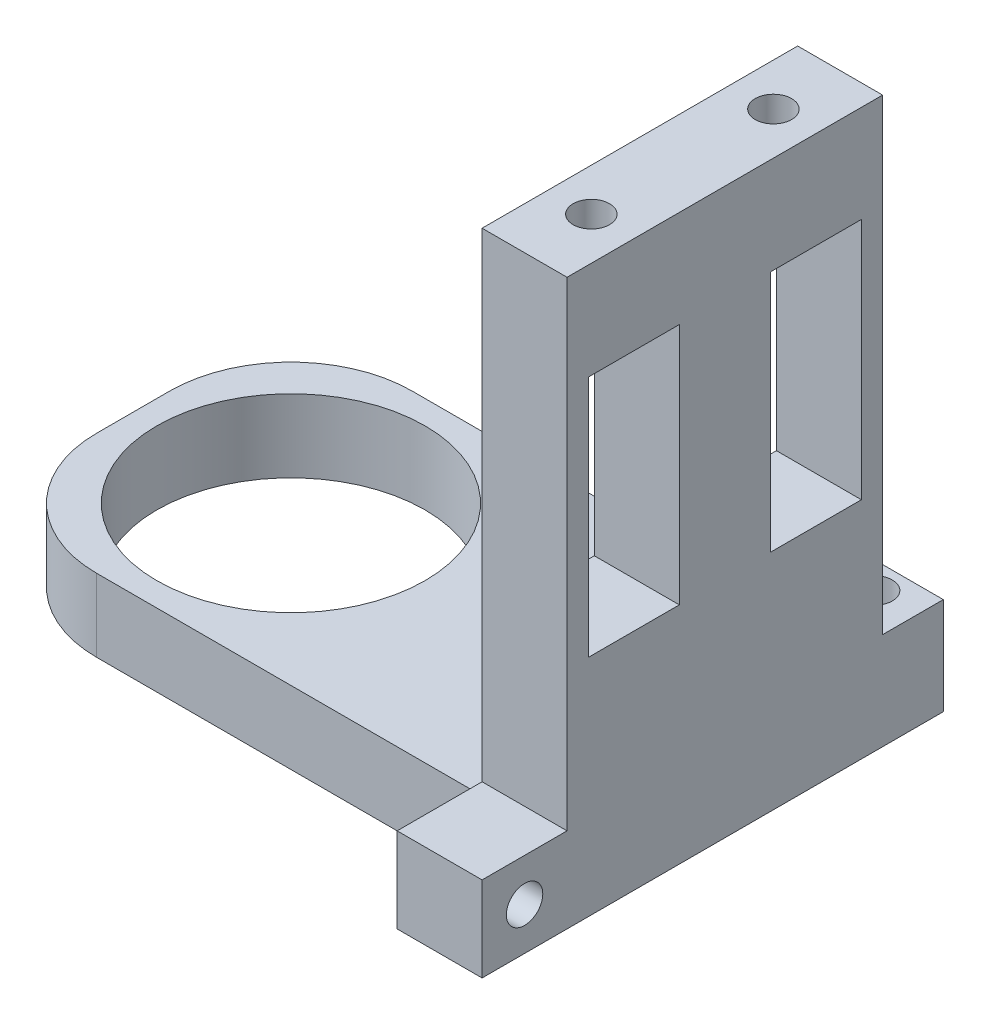
ISO-10303-21;
HEADER;
FILE_DESCRIPTION(('STEP AP214'),'2;1');
FILE_NAME('part.step','',(''),(''),'','','');
FILE_SCHEMA(('AUTOMOTIVE_DESIGN { 1 0 10303 214 1 1 1 1 }'));
ENDSEC;
DATA;
#1=APPLICATION_CONTEXT('core data for automotive mechanical design processes');
#2=APPLICATION_PROTOCOL_DEFINITION('international standard','automotive_design',2000,#1);
#3=PRODUCT_CONTEXT('',#1,'mechanical');
#4=PRODUCT('Part','Part','',(#3));
#5=PRODUCT_RELATED_PRODUCT_CATEGORY('part','',(#4));
#6=PRODUCT_DEFINITION_FORMATION('','',#4);
#7=PRODUCT_DEFINITION_CONTEXT('part definition',#1,'design');
#8=PRODUCT_DEFINITION('design','',#6,#7);
#9=PRODUCT_DEFINITION_SHAPE('','',#8);
#10=(LENGTH_UNIT() NAMED_UNIT(*) SI_UNIT(.MILLI.,.METRE.));
#11=(NAMED_UNIT(*) PLANE_ANGLE_UNIT() SI_UNIT($,.RADIAN.));
#12=(NAMED_UNIT(*) SI_UNIT($,.STERADIAN.) SOLID_ANGLE_UNIT());
#13=UNCERTAINTY_MEASURE_WITH_UNIT(LENGTH_MEASURE(1.E-05),#10,'distance_accuracy_value','');
#14=(GEOMETRIC_REPRESENTATION_CONTEXT(3) GLOBAL_UNCERTAINTY_ASSIGNED_CONTEXT((#13)) GLOBAL_UNIT_ASSIGNED_CONTEXT((#10,
#11,#12)) REPRESENTATION_CONTEXT('',''));
#15=CARTESIAN_POINT('',(0.,0.,0.));
#16=DIRECTION('',(0.,0.,1.));
#17=DIRECTION('',(1.,0.,0.));
#18=AXIS2_PLACEMENT_3D('',#15,#16,#17);
#19=CARTESIAN_POINT('',(17.375,0.,0.));
#20=DIRECTION('',(1.,0.,0.));
#21=DIRECTION('',(0.,0.,-1.));
#22=AXIS2_PLACEMENT_3D('',#19,#20,#21);
#23=PLANE('',#22);
#24=CARTESIAN_POINT('',(17.375,3.5,16.5));
#25=DIRECTION('',(1.,0.,0.));
#26=DIRECTION('',(0.,0.,-1.));
#27=AXIS2_PLACEMENT_3D('',#24,#25,#26);
#28=CIRCLE('',#27,1.49999999999998);
#29=CARTESIAN_POINT('',(17.375,3.5,15.));
#30=VERTEX_POINT('',#29);
#31=EDGE_CURVE('E414',#30,#30,#28,.T.);
#32=ORIENTED_EDGE('',*,*,#31,.T.);
#33=EDGE_LOOP('',(#32));
#34=FACE_BOUND('',#33,.T.);
#35=DIRECTION('',(0.,0.,-1.));
#36=VECTOR('',#35,1.);
#37=CARTESIAN_POINT('',(17.375,18.5,11.25));
#38=LINE('',#37,#36);
#39=CARTESIAN_POINT('',(17.375,18.5,11.25));
#40=VERTEX_POINT('',#39);
#41=CARTESIAN_POINT('',(17.375,18.5,3.75));
#42=VERTEX_POINT('',#41);
#43=EDGE_CURVE('E256',#40,#42,#38,.T.);
#44=ORIENTED_EDGE('',*,*,#43,.T.);
#45=DIRECTION('',(0.,1.,0.));
#46=VECTOR('',#45,1.);
#47=CARTESIAN_POINT('',(17.375,18.5,3.75));
#48=LINE('',#47,#46);
#49=CARTESIAN_POINT('',(17.375,38.5,3.75));
#50=VERTEX_POINT('',#49);
#51=EDGE_CURVE('E246',#42,#50,#48,.T.);
#52=ORIENTED_EDGE('',*,*,#51,.T.);
#53=DIRECTION('',(0.,0.,1.));
#54=VECTOR('',#53,1.);
#55=CARTESIAN_POINT('',(17.375,38.5,3.75));
#56=LINE('',#55,#54);
#57=CARTESIAN_POINT('',(17.375,38.5,11.25));
#58=VERTEX_POINT('',#57);
#59=EDGE_CURVE('E249',#50,#58,#56,.T.);
#60=ORIENTED_EDGE('',*,*,#59,.T.);
#61=DIRECTION('',(0.,-1.,0.));
#62=VECTOR('',#61,1.);
#63=CARTESIAN_POINT('',(17.375,38.5,11.25));
#64=LINE('',#63,#62);
#65=EDGE_CURVE('E253',#58,#40,#64,.T.);
#66=ORIENTED_EDGE('',*,*,#65,.T.);
#67=EDGE_LOOP('',(#44,#52,#60,#66));
#68=FACE_BOUND('',#67,.T.);
#69=DIRECTION('',(0.,0.,1.));
#70=VECTOR('',#69,1.);
#71=CARTESIAN_POINT('',(17.375,18.5,-11.25));
#72=LINE('',#71,#70);
#73=CARTESIAN_POINT('',(17.375,18.5,-11.25));
#74=VERTEX_POINT('',#73);
#75=CARTESIAN_POINT('',(17.375,18.5,-3.75));
#76=VERTEX_POINT('',#75);
#77=EDGE_CURVE('E229',#74,#76,#72,.T.);
#78=ORIENTED_EDGE('',*,*,#77,.F.);
#79=DIRECTION('',(0.,-1.,0.));
#80=VECTOR('',#79,1.);
#81=CARTESIAN_POINT('',(17.375,38.5,-11.25));
#82=LINE('',#81,#80);
#83=CARTESIAN_POINT('',(17.375,38.5,-11.25));
#84=VERTEX_POINT('',#83);
#85=EDGE_CURVE('E213',#84,#74,#82,.T.);
#86=ORIENTED_EDGE('',*,*,#85,.F.);
#87=DIRECTION('',(0.,0.,-1.));
#88=VECTOR('',#87,1.);
#89=CARTESIAN_POINT('',(17.375,38.5,-3.75));
#90=LINE('',#89,#88);
#91=CARTESIAN_POINT('',(17.375,38.5,-3.75));
#92=VERTEX_POINT('',#91);
#93=EDGE_CURVE('E218',#92,#84,#90,.T.);
#94=ORIENTED_EDGE('',*,*,#93,.F.);
#95=DIRECTION('',(0.,1.,0.));
#96=VECTOR('',#95,1.);
#97=CARTESIAN_POINT('',(17.375,18.5,-3.75));
#98=LINE('',#97,#96);
#99=EDGE_CURVE('E232',#76,#92,#98,.T.);
#100=ORIENTED_EDGE('',*,*,#99,.F.);
#101=EDGE_LOOP('',(#78,#86,#94,#100));
#102=FACE_BOUND('',#101,.T.);
#103=DIRECTION('',(0.,-1.,0.));
#104=VECTOR('',#103,1.);
#105=CARTESIAN_POINT('',(17.375,0.,-13.));
#106=LINE('',#105,#104);
#107=CARTESIAN_POINT('',(17.375,6.,-13.));
#108=VERTEX_POINT('',#107);
#109=CARTESIAN_POINT('',(17.375,0.,-13.));
#110=VERTEX_POINT('',#109);
#111=EDGE_CURVE('E199',#108,#110,#106,.T.);
#112=ORIENTED_EDGE('',*,*,#111,.F.);
#113=DIRECTION('',(0.,0.,-1.));
#114=VECTOR('',#113,1.);
#115=CARTESIAN_POINT('',(17.375,6.,-13.));
#116=LINE('',#115,#114);
#117=CARTESIAN_POINT('',(17.375,6.,13.));
#118=VERTEX_POINT('',#117);
#119=EDGE_CURVE('E185',#118,#108,#116,.T.);
#120=ORIENTED_EDGE('',*,*,#119,.F.);
#121=DIRECTION('',(0.,1.,0.));
#122=VECTOR('',#121,1.);
#123=CARTESIAN_POINT('',(17.375,6.,13.));
#124=LINE('',#123,#122);
#125=CARTESIAN_POINT('',(17.375,0.,13.));
#126=VERTEX_POINT('',#125);
#127=EDGE_CURVE('E195',#126,#118,#124,.T.);
#128=ORIENTED_EDGE('',*,*,#127,.F.);
#129=DIRECTION('',(0.,0.,-1.));
#130=VECTOR('',#129,1.);
#131=CARTESIAN_POINT('',(17.375,0.,20.));
#132=LINE('',#131,#130);
#133=CARTESIAN_POINT('',(17.375,0.,20.));
#134=VERTEX_POINT('',#133);
#135=EDGE_CURVE('E318',#134,#126,#132,.T.);
#136=ORIENTED_EDGE('',*,*,#135,.F.);
#137=DIRECTION('',(0.,-1.,0.));
#138=VECTOR('',#137,1.);
#139=CARTESIAN_POINT('',(17.375,46.5,20.));
#140=LINE('',#139,#138);
#141=CARTESIAN_POINT('',(17.375,7.,20.));
#142=VERTEX_POINT('',#141);
#143=EDGE_CURVE('E314',#142,#134,#140,.T.);
#144=ORIENTED_EDGE('',*,*,#143,.F.);
#145=DIRECTION('',(0.,0.,1.));
#146=VECTOR('',#145,1.);
#147=CARTESIAN_POINT('',(17.375,7.,13.));
#148=LINE('',#147,#146);
#149=CARTESIAN_POINT('',(17.375,7.,13.));
#150=VERTEX_POINT('',#149);
#151=EDGE_CURVE('E282',#150,#142,#148,.T.);
#152=ORIENTED_EDGE('',*,*,#151,.F.);
#153=DIRECTION('',(0.,-1.,0.));
#154=VECTOR('',#153,1.);
#155=CARTESIAN_POINT('',(17.375,46.5,13.));
#156=LINE('',#155,#154);
#157=CARTESIAN_POINT('',(17.375,46.5,13.));
#158=VERTEX_POINT('',#157);
#159=EDGE_CURVE('E271',#158,#150,#156,.T.);
#160=ORIENTED_EDGE('',*,*,#159,.F.);
#161=DIRECTION('',(0.,0.,1.));
#162=VECTOR('',#161,1.);
#163=CARTESIAN_POINT('',(17.375,46.5,-18.));
#164=LINE('',#163,#162);
#165=CARTESIAN_POINT('',(17.375,46.5,-13.));
#166=VERTEX_POINT('',#165);
#167=EDGE_CURVE('E323',#166,#158,#164,.T.);
#168=ORIENTED_EDGE('',*,*,#167,.F.);
#169=DIRECTION('',(0.,1.,0.));
#170=VECTOR('',#169,1.);
#171=CARTESIAN_POINT('',(17.375,8.,-13.));
#172=LINE('',#171,#170);
#173=CARTESIAN_POINT('',(17.375,8.,-13.));
#174=VERTEX_POINT('',#173);
#175=EDGE_CURVE('E300',#174,#166,#172,.T.);
#176=ORIENTED_EDGE('',*,*,#175,.F.);
#177=DIRECTION('',(0.,0.,1.));
#178=VECTOR('',#177,1.);
#179=CARTESIAN_POINT('',(17.375,8.,-18.));
#180=LINE('',#179,#178);
#181=CARTESIAN_POINT('',(17.375,8.,-18.));
#182=VERTEX_POINT('',#181);
#183=EDGE_CURVE('E292',#182,#174,#180,.T.);
#184=ORIENTED_EDGE('',*,*,#183,.F.);
#185=DIRECTION('',(0.,1.,0.));
#186=VECTOR('',#185,1.);
#187=CARTESIAN_POINT('',(17.375,0.,-18.));
#188=LINE('',#187,#186);
#189=CARTESIAN_POINT('',(17.375,0.,-18.));
#190=VERTEX_POINT('',#189);
#191=EDGE_CURVE('E320',#190,#182,#188,.T.);
#192=ORIENTED_EDGE('',*,*,#191,.F.);
#193=EDGE_CURVE('E316',#110,#190,#132,.T.);
#194=ORIENTED_EDGE('',*,*,#193,.F.);
#195=EDGE_LOOP('',(#112,#120,#128,#136,#144,#152,#160,#168,#176,#184,#192,#194));
#196=FACE_BOUND('',#195,.T.);
#197=ADVANCED_FACE('F32',(#34,#68,#102,#196),#23,.F.);
#198=CARTESIAN_POINT('',(17.375,46.5,20.));
#199=DIRECTION('',(0.,0.,1.));
#200=DIRECTION('',(1.,0.,0.));
#201=AXIS2_PLACEMENT_3D('',#198,#199,#200);
#202=PLANE('',#201);
#203=DIRECTION('',(-1.,0.,0.));
#204=VECTOR('',#203,1.);
#205=CARTESIAN_POINT('',(24.375,7.,20.));
#206=LINE('',#205,#204);
#207=CARTESIAN_POINT('',(24.375,7.,20.));
#208=VERTEX_POINT('',#207);
#209=EDGE_CURVE('E289',#208,#142,#206,.T.);
#210=ORIENTED_EDGE('',*,*,#209,.T.);
#211=ORIENTED_EDGE('',*,*,#143,.T.);
#212=DIRECTION('',(1.,0.,0.));
#213=VECTOR('',#212,1.);
#214=CARTESIAN_POINT('',(17.375,0.,20.));
#215=LINE('',#214,#213);
#216=CARTESIAN_POINT('',(24.375,0.,20.));
#217=VERTEX_POINT('',#216);
#218=EDGE_CURVE('E326',#134,#217,#215,.T.);
#219=ORIENTED_EDGE('',*,*,#218,.T.);
#220=DIRECTION('',(0.,-1.,0.));
#221=VECTOR('',#220,1.);
#222=CARTESIAN_POINT('',(24.375,46.5,20.));
#223=LINE('',#222,#221);
#224=EDGE_CURVE('E309',#208,#217,#223,.T.);
#225=ORIENTED_EDGE('',*,*,#224,.F.);
#226=EDGE_LOOP('',(#210,#211,#219,#225));
#227=FACE_BOUND('',#226,.T.);
#228=ADVANCED_FACE('F373',(#227),#202,.T.);
#229=CARTESIAN_POINT('',(17.375,46.5,-18.));
#230=DIRECTION('',(0.,1.,0.));
#231=DIRECTION('',(0.,0.,1.));
#232=AXIS2_PLACEMENT_3D('',#229,#230,#231);
#233=PLANE('',#232);
#234=CARTESIAN_POINT('',(20.875,46.5,7.5));
#235=DIRECTION('',(0.,1.,0.));
#236=DIRECTION('',(0.,0.,1.));
#237=AXIS2_PLACEMENT_3D('',#234,#235,#236);
#238=CIRCLE('',#237,1.49999999999999);
#239=CARTESIAN_POINT('',(20.875,46.5,8.99999999999999));
#240=VERTEX_POINT('',#239);
#241=EDGE_CURVE('E422',#240,#240,#238,.T.);
#242=ORIENTED_EDGE('',*,*,#241,.F.);
#243=EDGE_LOOP('',(#242));
#244=FACE_BOUND('',#243,.T.);
#245=CARTESIAN_POINT('',(20.875,46.5,-7.5));
#246=DIRECTION('',(0.,1.,0.));
#247=DIRECTION('',(0.,0.,1.));
#248=AXIS2_PLACEMENT_3D('',#245,#246,#247);
#249=CIRCLE('',#248,1.49999999999999);
#250=CARTESIAN_POINT('',(20.875,46.5,-6.00000000000001));
#251=VERTEX_POINT('',#250);
#252=EDGE_CURVE('E428',#251,#251,#249,.T.);
#253=ORIENTED_EDGE('',*,*,#252,.F.);
#254=EDGE_LOOP('',(#253));
#255=FACE_BOUND('',#254,.T.);
#256=DIRECTION('',(-1.,0.,0.));
#257=VECTOR('',#256,1.);
#258=CARTESIAN_POINT('',(24.375,46.5,13.));
#259=LINE('',#258,#257);
#260=CARTESIAN_POINT('',(24.375,46.5,13.));
#261=VERTEX_POINT('',#260);
#262=EDGE_CURVE('E285',#261,#158,#259,.T.);
#263=ORIENTED_EDGE('',*,*,#262,.F.);
#264=DIRECTION('',(0.,0.,1.));
#265=VECTOR('',#264,1.);
#266=CARTESIAN_POINT('',(24.375,46.5,-18.));
#267=LINE('',#266,#265);
#268=CARTESIAN_POINT('',(24.375,46.5,-13.));
#269=VERTEX_POINT('',#268);
#270=EDGE_CURVE('E317',#269,#261,#267,.T.);
#271=ORIENTED_EDGE('',*,*,#270,.F.);
#272=DIRECTION('',(-1.,0.,0.));
#273=VECTOR('',#272,1.);
#274=CARTESIAN_POINT('',(24.375,46.5,-13.));
#275=LINE('',#274,#273);
#276=EDGE_CURVE('E310',#269,#166,#275,.T.);
#277=ORIENTED_EDGE('',*,*,#276,.T.);
#278=ORIENTED_EDGE('',*,*,#167,.T.);
#279=EDGE_LOOP('',(#263,#271,#277,#278));
#280=FACE_BOUND('',#279,.T.);
#281=ADVANCED_FACE('F379',(#244,#255,#280),#233,.T.);
#282=CARTESIAN_POINT('',(17.375,0.,-18.));
#283=DIRECTION('',(0.,0.,-1.));
#284=DIRECTION('',(-1.,0.,0.));
#285=AXIS2_PLACEMENT_3D('',#282,#283,#284);
#286=PLANE('',#285);
#287=DIRECTION('',(-1.,0.,0.));
#288=VECTOR('',#287,1.);
#289=CARTESIAN_POINT('',(24.375,8.,-18.));
#290=LINE('',#289,#288);
#291=CARTESIAN_POINT('',(24.375,8.,-18.));
#292=VERTEX_POINT('',#291);
#293=EDGE_CURVE('E307',#292,#182,#290,.T.);
#294=ORIENTED_EDGE('',*,*,#293,.F.);
#295=DIRECTION('',(0.,1.,0.));
#296=VECTOR('',#295,1.);
#297=CARTESIAN_POINT('',(24.375,0.,-18.));
#298=LINE('',#297,#296);
#299=CARTESIAN_POINT('',(24.375,0.,-18.));
#300=VERTEX_POINT('',#299);
#301=EDGE_CURVE('E331',#300,#292,#298,.T.);
#302=ORIENTED_EDGE('',*,*,#301,.F.);
#303=DIRECTION('',(1.,0.,0.));
#304=VECTOR('',#303,1.);
#305=CARTESIAN_POINT('',(17.375,0.,-18.));
#306=LINE('',#305,#304);
#307=EDGE_CURVE('E336',#190,#300,#306,.T.);
#308=ORIENTED_EDGE('',*,*,#307,.F.);
#309=ORIENTED_EDGE('',*,*,#191,.T.);
#310=EDGE_LOOP('',(#294,#302,#308,#309));
#311=FACE_BOUND('',#310,.T.);
#312=ADVANCED_FACE('F393',(#311),#286,.T.);
#313=CARTESIAN_POINT('',(17.375,0.,20.));
#314=DIRECTION('',(0.,-1.,0.));
#315=DIRECTION('',(0.,0.,-1.));
#316=AXIS2_PLACEMENT_3D('',#313,#314,#315);
#317=PLANE('',#316);
#318=CARTESIAN_POINT('',(-11.375,0.,0.));
#319=DIRECTION('',(0.,-1.,0.));
#320=DIRECTION('',(0.,0.,-1.));
#321=AXIS2_PLACEMENT_3D('',#318,#319,#320);
#322=CIRCLE('',#321,11.05);
#323=CARTESIAN_POINT('',(-11.375,0.,-11.05));
#324=VERTEX_POINT('',#323);
#325=EDGE_CURVE('E405',#324,#324,#322,.T.);
#326=ORIENTED_EDGE('',*,*,#325,.F.);
#327=EDGE_LOOP('',(#326));
#328=FACE_BOUND('',#327,.T.);
#329=CARTESIAN_POINT('',(20.875,0.,-15.8));
#330=DIRECTION('',(0.,1.,0.));
#331=DIRECTION('',(0.,0.,1.));
#332=AXIS2_PLACEMENT_3D('',#329,#330,#331);
#333=CIRCLE('',#332,1.49999999999999);
#334=CARTESIAN_POINT('',(20.875,0.,-14.3));
#335=VERTEX_POINT('',#334);
#336=EDGE_CURVE('E408',#335,#335,#333,.T.);
#337=ORIENTED_EDGE('',*,*,#336,.T.);
#338=EDGE_LOOP('',(#337));
#339=FACE_BOUND('',#338,.T.);
#340=DIRECTION('',(1.,0.,0.));
#341=VECTOR('',#340,1.);
#342=CARTESIAN_POINT('',(-24.375,0.,13.));
#343=LINE('',#342,#341);
#344=CARTESIAN_POINT('',(-14.375,0.,13.));
#345=VERTEX_POINT('',#344);
#346=EDGE_CURVE('E188',#345,#126,#343,.T.);
#347=ORIENTED_EDGE('',*,*,#346,.F.);
#348=CARTESIAN_POINT('',(-14.375,0.,3.));
#349=DIRECTION('',(0.,-1.,0.));
#350=DIRECTION('',(0.,0.,-1.));
#351=AXIS2_PLACEMENT_3D('',#348,#349,#350);
#352=CIRCLE('',#351,10.);
#353=CARTESIAN_POINT('',(-24.375,0.,3.));
#354=VERTEX_POINT('',#353);
#355=EDGE_CURVE('E40',#345,#354,#352,.T.);
#356=ORIENTED_EDGE('',*,*,#355,.T.);
#357=DIRECTION('',(0.,0.,1.));
#358=VECTOR('',#357,1.);
#359=CARTESIAN_POINT('',(-24.375,0.,13.));
#360=LINE('',#359,#358);
#361=CARTESIAN_POINT('',(-24.375,0.,-2.99999999999999));
#362=VERTEX_POINT('',#361);
#363=EDGE_CURVE('E200',#362,#354,#360,.T.);
#364=ORIENTED_EDGE('',*,*,#363,.F.);
#365=CARTESIAN_POINT('',(-14.375,0.,-3.));
#366=DIRECTION('',(0.,-1.,0.));
#367=DIRECTION('',(0.,0.,-1.));
#368=AXIS2_PLACEMENT_3D('',#365,#366,#367);
#369=CIRCLE('',#368,10.);
#370=CARTESIAN_POINT('',(-14.375,0.,-13.));
#371=VERTEX_POINT('',#370);
#372=EDGE_CURVE('E47',#362,#371,#369,.T.);
#373=ORIENTED_EDGE('',*,*,#372,.T.);
#374=DIRECTION('',(1.,0.,0.));
#375=VECTOR('',#374,1.);
#376=CARTESIAN_POINT('',(-24.375,0.,-13.));
#377=LINE('',#376,#375);
#378=EDGE_CURVE('E211',#371,#110,#377,.T.);
#379=ORIENTED_EDGE('',*,*,#378,.T.);
#380=ORIENTED_EDGE('',*,*,#193,.T.);
#381=ORIENTED_EDGE('',*,*,#307,.T.);
#382=DIRECTION('',(0.,0.,-1.));
#383=VECTOR('',#382,1.);
#384=CARTESIAN_POINT('',(24.375,0.,20.));
#385=LINE('',#384,#383);
#386=EDGE_CURVE('E328',#217,#300,#385,.T.);
#387=ORIENTED_EDGE('',*,*,#386,.F.);
#388=ORIENTED_EDGE('',*,*,#218,.F.);
#389=ORIENTED_EDGE('',*,*,#135,.T.);
#390=EDGE_LOOP('',(#347,#356,#364,#373,#379,#380,#381,#387,#388,#389));
#391=FACE_BOUND('',#390,.T.);
#392=ADVANCED_FACE('F352',(#328,#339,#391),#317,.T.);
#393=CARTESIAN_POINT('',(24.375,0.,0.));
#394=DIRECTION('',(1.,0.,0.));
#395=DIRECTION('',(0.,0.,-1.));
#396=AXIS2_PLACEMENT_3D('',#393,#394,#395);
#397=PLANE('',#396);
#398=CARTESIAN_POINT('',(24.375,3.5,16.5));
#399=DIRECTION('',(1.,0.,0.));
#400=DIRECTION('',(0.,0.,-1.));
#401=AXIS2_PLACEMENT_3D('',#398,#399,#400);
#402=CIRCLE('',#401,1.49999999999999);
#403=CARTESIAN_POINT('',(24.375,3.5,15.));
#404=VERTEX_POINT('',#403);
#405=EDGE_CURVE('E410',#404,#404,#402,.T.);
#406=ORIENTED_EDGE('',*,*,#405,.F.);
#407=EDGE_LOOP('',(#406));
#408=FACE_BOUND('',#407,.T.);
#409=DIRECTION('',(0.,-1.,0.));
#410=VECTOR('',#409,1.);
#411=CARTESIAN_POINT('',(24.375,38.5,-11.25));
#412=LINE('',#411,#410);
#413=CARTESIAN_POINT('',(24.375,38.5,-11.25));
#414=VERTEX_POINT('',#413);
#415=CARTESIAN_POINT('',(24.375,18.5,-11.25));
#416=VERTEX_POINT('',#415);
#417=EDGE_CURVE('E214',#414,#416,#412,.T.);
#418=ORIENTED_EDGE('',*,*,#417,.T.);
#419=DIRECTION('',(0.,0.,1.));
#420=VECTOR('',#419,1.);
#421=CARTESIAN_POINT('',(24.375,18.5,-11.25));
#422=LINE('',#421,#420);
#423=CARTESIAN_POINT('',(24.375,18.5,-3.75));
#424=VERTEX_POINT('',#423);
#425=EDGE_CURVE('E217',#416,#424,#422,.T.);
#426=ORIENTED_EDGE('',*,*,#425,.T.);
#427=DIRECTION('',(0.,1.,0.));
#428=VECTOR('',#427,1.);
#429=CARTESIAN_POINT('',(24.375,18.5,-3.75));
#430=LINE('',#429,#428);
#431=CARTESIAN_POINT('',(24.375,38.5,-3.75));
#432=VERTEX_POINT('',#431);
#433=EDGE_CURVE('E221',#424,#432,#430,.T.);
#434=ORIENTED_EDGE('',*,*,#433,.T.);
#435=DIRECTION('',(0.,0.,-1.));
#436=VECTOR('',#435,1.);
#437=CARTESIAN_POINT('',(24.375,38.5,-3.75));
#438=LINE('',#437,#436);
#439=EDGE_CURVE('E224',#432,#414,#438,.T.);
#440=ORIENTED_EDGE('',*,*,#439,.T.);
#441=EDGE_LOOP('',(#418,#426,#434,#440));
#442=FACE_BOUND('',#441,.T.);
#443=DIRECTION('',(0.,1.,0.));
#444=VECTOR('',#443,1.);
#445=CARTESIAN_POINT('',(24.375,18.5,3.75));
#446=LINE('',#445,#444);
#447=CARTESIAN_POINT('',(24.375,18.5,3.75));
#448=VERTEX_POINT('',#447);
#449=CARTESIAN_POINT('',(24.375,38.5,3.75));
#450=VERTEX_POINT('',#449);
#451=EDGE_CURVE('E239',#448,#450,#446,.T.);
#452=ORIENTED_EDGE('',*,*,#451,.F.);
#453=DIRECTION('',(0.,0.,-1.));
#454=VECTOR('',#453,1.);
#455=CARTESIAN_POINT('',(24.375,18.5,11.25));
#456=LINE('',#455,#454);
#457=CARTESIAN_POINT('',(24.375,18.5,11.25));
#458=VERTEX_POINT('',#457);
#459=EDGE_CURVE('E250',#458,#448,#456,.T.);
#460=ORIENTED_EDGE('',*,*,#459,.F.);
#461=DIRECTION('',(0.,-1.,0.));
#462=VECTOR('',#461,1.);
#463=CARTESIAN_POINT('',(24.375,38.5,11.25));
#464=LINE('',#463,#462);
#465=CARTESIAN_POINT('',(24.375,38.5,11.25));
#466=VERTEX_POINT('',#465);
#467=EDGE_CURVE('E264',#466,#458,#464,.T.);
#468=ORIENTED_EDGE('',*,*,#467,.F.);
#469=DIRECTION('',(0.,0.,1.));
#470=VECTOR('',#469,1.);
#471=CARTESIAN_POINT('',(24.375,38.5,3.75));
#472=LINE('',#471,#470);
#473=EDGE_CURVE('E261',#450,#466,#472,.T.);
#474=ORIENTED_EDGE('',*,*,#473,.F.);
#475=EDGE_LOOP('',(#452,#460,#468,#474));
#476=FACE_BOUND('',#475,.T.);
#477=DIRECTION('',(0.,0.,1.));
#478=VECTOR('',#477,1.);
#479=CARTESIAN_POINT('',(24.375,7.,13.));
#480=LINE('',#479,#478);
#481=CARTESIAN_POINT('',(24.375,7.,13.));
#482=VERTEX_POINT('',#481);
#483=EDGE_CURVE('E281',#482,#208,#480,.T.);
#484=ORIENTED_EDGE('',*,*,#483,.T.);
#485=ORIENTED_EDGE('',*,*,#224,.T.);
#486=ORIENTED_EDGE('',*,*,#386,.T.);
#487=ORIENTED_EDGE('',*,*,#301,.T.);
#488=DIRECTION('',(0.,0.,1.));
#489=VECTOR('',#488,1.);
#490=CARTESIAN_POINT('',(24.375,8.,-18.));
#491=LINE('',#490,#489);
#492=CARTESIAN_POINT('',(24.375,8.,-13.));
#493=VERTEX_POINT('',#492);
#494=EDGE_CURVE('E296',#292,#493,#491,.T.);
#495=ORIENTED_EDGE('',*,*,#494,.T.);
#496=DIRECTION('',(0.,1.,0.));
#497=VECTOR('',#496,1.);
#498=CARTESIAN_POINT('',(24.375,8.,-13.));
#499=LINE('',#498,#497);
#500=EDGE_CURVE('E299',#493,#269,#499,.T.);
#501=ORIENTED_EDGE('',*,*,#500,.T.);
#502=ORIENTED_EDGE('',*,*,#270,.T.);
#503=DIRECTION('',(0.,-1.,0.));
#504=VECTOR('',#503,1.);
#505=CARTESIAN_POINT('',(24.375,46.5,13.));
#506=LINE('',#505,#504);
#507=EDGE_CURVE('E278',#261,#482,#506,.T.);
#508=ORIENTED_EDGE('',*,*,#507,.T.);
#509=EDGE_LOOP('',(#484,#485,#486,#487,#495,#501,#502,#508));
#510=FACE_BOUND('',#509,.T.);
#511=ADVANCED_FACE('F387',(#408,#442,#476,#510),#397,.T.);
#512=CARTESIAN_POINT('',(24.375,8.,-18.));
#513=DIRECTION('',(0.,-1.,0.));
#514=DIRECTION('',(0.,0.,-1.));
#515=AXIS2_PLACEMENT_3D('',#512,#513,#514);
#516=PLANE('',#515);
#517=CARTESIAN_POINT('',(20.875,8.,-15.8));
#518=DIRECTION('',(0.,1.,0.));
#519=DIRECTION('',(0.,0.,1.));
#520=AXIS2_PLACEMENT_3D('',#517,#518,#519);
#521=CIRCLE('',#520,1.49999999999999);
#522=CARTESIAN_POINT('',(20.875,8.,-14.3));
#523=VERTEX_POINT('',#522);
#524=EDGE_CURVE('E411',#523,#523,#521,.T.);
#525=ORIENTED_EDGE('',*,*,#524,.F.);
#526=EDGE_LOOP('',(#525));
#527=FACE_BOUND('',#526,.T.);
#528=ORIENTED_EDGE('',*,*,#183,.T.);
#529=DIRECTION('',(-1.,0.,0.));
#530=VECTOR('',#529,1.);
#531=CARTESIAN_POINT('',(24.375,8.,-13.));
#532=LINE('',#531,#530);
#533=EDGE_CURVE('E303',#493,#174,#532,.T.);
#534=ORIENTED_EDGE('',*,*,#533,.F.);
#535=ORIENTED_EDGE('',*,*,#494,.F.);
#536=ORIENTED_EDGE('',*,*,#293,.T.);
#537=EDGE_LOOP('',(#528,#534,#535,#536));
#538=FACE_BOUND('',#537,.T.);
#539=ADVANCED_FACE('F385',(#527,#538),#516,.F.);
#540=CARTESIAN_POINT('',(24.375,8.,-13.));
#541=DIRECTION('',(0.,0.,1.));
#542=DIRECTION('',(1.,0.,0.));
#543=AXIS2_PLACEMENT_3D('',#540,#541,#542);
#544=PLANE('',#543);
#545=ORIENTED_EDGE('',*,*,#175,.T.);
#546=ORIENTED_EDGE('',*,*,#276,.F.);
#547=ORIENTED_EDGE('',*,*,#500,.F.);
#548=ORIENTED_EDGE('',*,*,#533,.T.);
#549=EDGE_LOOP('',(#545,#546,#547,#548));
#550=FACE_BOUND('',#549,.T.);
#551=ADVANCED_FACE('F460',(#550),#544,.F.);
#552=CARTESIAN_POINT('',(24.375,7.,13.));
#553=DIRECTION('',(0.,-1.,0.));
#554=DIRECTION('',(0.,0.,-1.));
#555=AXIS2_PLACEMENT_3D('',#552,#553,#554);
#556=PLANE('',#555);
#557=ORIENTED_EDGE('',*,*,#151,.T.);
#558=ORIENTED_EDGE('',*,*,#209,.F.);
#559=ORIENTED_EDGE('',*,*,#483,.F.);
#560=DIRECTION('',(-1.,0.,0.));
#561=VECTOR('',#560,1.);
#562=CARTESIAN_POINT('',(24.375,7.,13.));
#563=LINE('',#562,#561);
#564=EDGE_CURVE('E293',#482,#150,#563,.T.);
#565=ORIENTED_EDGE('',*,*,#564,.T.);
#566=EDGE_LOOP('',(#557,#558,#559,#565));
#567=FACE_BOUND('',#566,.T.);
#568=ADVANCED_FACE('F451',(#567),#556,.F.);
#569=CARTESIAN_POINT('',(24.375,46.5,13.));
#570=DIRECTION('',(0.,0.,-1.));
#571=DIRECTION('',(-1.,0.,0.));
#572=AXIS2_PLACEMENT_3D('',#569,#570,#571);
#573=PLANE('',#572);
#574=ORIENTED_EDGE('',*,*,#159,.T.);
#575=ORIENTED_EDGE('',*,*,#564,.F.);
#576=ORIENTED_EDGE('',*,*,#507,.F.);
#577=ORIENTED_EDGE('',*,*,#262,.T.);
#578=EDGE_LOOP('',(#574,#575,#576,#577));
#579=FACE_BOUND('',#578,.T.);
#580=ADVANCED_FACE('F454',(#579),#573,.F.);
#581=CARTESIAN_POINT('',(17.375,18.5,3.75));
#582=DIRECTION('',(0.,0.,-1.));
#583=DIRECTION('',(-1.,0.,0.));
#584=AXIS2_PLACEMENT_3D('',#581,#582,#583);
#585=PLANE('',#584);
#586=ORIENTED_EDGE('',*,*,#451,.T.);
#587=DIRECTION('',(1.,0.,0.));
#588=VECTOR('',#587,1.);
#589=CARTESIAN_POINT('',(17.375,38.5,3.75));
#590=LINE('',#589,#588);
#591=EDGE_CURVE('E259',#50,#450,#590,.T.);
#592=ORIENTED_EDGE('',*,*,#591,.F.);
#593=ORIENTED_EDGE('',*,*,#51,.F.);
#594=DIRECTION('',(1.,0.,0.));
#595=VECTOR('',#594,1.);
#596=CARTESIAN_POINT('',(17.375,18.5,3.75));
#597=LINE('',#596,#595);
#598=EDGE_CURVE('E269',#42,#448,#597,.T.);
#599=ORIENTED_EDGE('',*,*,#598,.T.);
#600=EDGE_LOOP('',(#586,#592,#593,#599));
#601=FACE_BOUND('',#600,.T.);
#602=ADVANCED_FACE('F516',(#601),#585,.F.);
#603=CARTESIAN_POINT('',(17.375,18.5,11.25));
#604=DIRECTION('',(0.,-1.,0.));
#605=DIRECTION('',(0.,0.,-1.));
#606=AXIS2_PLACEMENT_3D('',#603,#604,#605);
#607=PLANE('',#606);
#608=ORIENTED_EDGE('',*,*,#459,.T.);
#609=ORIENTED_EDGE('',*,*,#598,.F.);
#610=ORIENTED_EDGE('',*,*,#43,.F.);
#611=DIRECTION('',(1.,0.,0.));
#612=VECTOR('',#611,1.);
#613=CARTESIAN_POINT('',(17.375,18.5,11.25));
#614=LINE('',#613,#612);
#615=EDGE_CURVE('E272',#40,#458,#614,.T.);
#616=ORIENTED_EDGE('',*,*,#615,.T.);
#617=EDGE_LOOP('',(#608,#609,#610,#616));
#618=FACE_BOUND('',#617,.T.);
#619=ADVANCED_FACE('F512',(#618),#607,.F.);
#620=CARTESIAN_POINT('',(17.375,38.5,11.25));
#621=DIRECTION('',(0.,0.,1.));
#622=DIRECTION('',(1.,0.,0.));
#623=AXIS2_PLACEMENT_3D('',#620,#621,#622);
#624=PLANE('',#623);
#625=ORIENTED_EDGE('',*,*,#467,.T.);
#626=ORIENTED_EDGE('',*,*,#615,.F.);
#627=ORIENTED_EDGE('',*,*,#65,.F.);
#628=DIRECTION('',(1.,0.,0.));
#629=VECTOR('',#628,1.);
#630=CARTESIAN_POINT('',(17.375,38.5,11.25));
#631=LINE('',#630,#629);
#632=EDGE_CURVE('E274',#58,#466,#631,.T.);
#633=ORIENTED_EDGE('',*,*,#632,.T.);
#634=EDGE_LOOP('',(#625,#626,#627,#633));
#635=FACE_BOUND('',#634,.T.);
#636=ADVANCED_FACE('F515',(#635),#624,.F.);
#637=CARTESIAN_POINT('',(17.375,38.5,3.75));
#638=DIRECTION('',(0.,1.,0.));
#639=DIRECTION('',(0.,0.,1.));
#640=AXIS2_PLACEMENT_3D('',#637,#638,#639);
#641=PLANE('',#640);
#642=CARTESIAN_POINT('',(20.875,38.5,7.5));
#643=DIRECTION('',(0.,1.,0.));
#644=DIRECTION('',(0.,0.,1.));
#645=AXIS2_PLACEMENT_3D('',#642,#643,#644);
#646=CIRCLE('',#645,1.49999999999999);
#647=CARTESIAN_POINT('',(20.875,38.5,8.99999999999999));
#648=VERTEX_POINT('',#647);
#649=EDGE_CURVE('E425',#648,#648,#646,.T.);
#650=ORIENTED_EDGE('',*,*,#649,.T.);
#651=EDGE_LOOP('',(#650));
#652=FACE_BOUND('',#651,.T.);
#653=ORIENTED_EDGE('',*,*,#473,.T.);
#654=ORIENTED_EDGE('',*,*,#632,.F.);
#655=ORIENTED_EDGE('',*,*,#59,.F.);
#656=ORIENTED_EDGE('',*,*,#591,.T.);
#657=EDGE_LOOP('',(#653,#654,#655,#656));
#658=FACE_BOUND('',#657,.T.);
#659=ADVANCED_FACE('F510',(#652,#658),#641,.F.);
#660=CARTESIAN_POINT('',(24.375,38.5,-11.25));
#661=DIRECTION('',(0.,0.,-1.));
#662=DIRECTION('',(-1.,0.,0.));
#663=AXIS2_PLACEMENT_3D('',#660,#661,#662);
#664=PLANE('',#663);
#665=ORIENTED_EDGE('',*,*,#85,.T.);
#666=DIRECTION('',(-1.,0.,0.));
#667=VECTOR('',#666,1.);
#668=CARTESIAN_POINT('',(24.375,18.5,-11.25));
#669=LINE('',#668,#667);
#670=EDGE_CURVE('E227',#416,#74,#669,.T.);
#671=ORIENTED_EDGE('',*,*,#670,.F.);
#672=ORIENTED_EDGE('',*,*,#417,.F.);
#673=DIRECTION('',(-1.,0.,0.));
#674=VECTOR('',#673,1.);
#675=CARTESIAN_POINT('',(24.375,38.5,-11.25));
#676=LINE('',#675,#674);
#677=EDGE_CURVE('E237',#414,#84,#676,.T.);
#678=ORIENTED_EDGE('',*,*,#677,.T.);
#679=EDGE_LOOP('',(#665,#671,#672,#678));
#680=FACE_BOUND('',#679,.T.);
#681=ADVANCED_FACE('F500',(#680),#664,.F.);
#682=CARTESIAN_POINT('',(24.375,38.5,-3.75));
#683=DIRECTION('',(0.,1.,0.));
#684=DIRECTION('',(0.,0.,1.));
#685=AXIS2_PLACEMENT_3D('',#682,#683,#684);
#686=PLANE('',#685);
#687=CARTESIAN_POINT('',(20.875,38.5,-7.5));
#688=DIRECTION('',(0.,1.,0.));
#689=DIRECTION('',(0.,0.,1.));
#690=AXIS2_PLACEMENT_3D('',#687,#688,#689);
#691=CIRCLE('',#690,1.49999999999999);
#692=CARTESIAN_POINT('',(20.875,38.5,-6.00000000000001));
#693=VERTEX_POINT('',#692);
#694=EDGE_CURVE('E204',#693,#693,#691,.T.);
#695=ORIENTED_EDGE('',*,*,#694,.T.);
#696=EDGE_LOOP('',(#695));
#697=FACE_BOUND('',#696,.T.);
#698=ORIENTED_EDGE('',*,*,#93,.T.);
#699=ORIENTED_EDGE('',*,*,#677,.F.);
#700=ORIENTED_EDGE('',*,*,#439,.F.);
#701=DIRECTION('',(-1.,0.,0.));
#702=VECTOR('',#701,1.);
#703=CARTESIAN_POINT('',(24.375,38.5,-3.75));
#704=LINE('',#703,#702);
#705=EDGE_CURVE('E240',#432,#92,#704,.T.);
#706=ORIENTED_EDGE('',*,*,#705,.T.);
#707=EDGE_LOOP('',(#698,#699,#700,#706));
#708=FACE_BOUND('',#707,.T.);
#709=ADVANCED_FACE('F496',(#697,#708),#686,.F.);
#710=CARTESIAN_POINT('',(24.375,18.5,-3.75));
#711=DIRECTION('',(0.,0.,1.));
#712=DIRECTION('',(1.,0.,0.));
#713=AXIS2_PLACEMENT_3D('',#710,#711,#712);
#714=PLANE('',#713);
#715=ORIENTED_EDGE('',*,*,#99,.T.);
#716=ORIENTED_EDGE('',*,*,#705,.F.);
#717=ORIENTED_EDGE('',*,*,#433,.F.);
#718=DIRECTION('',(-1.,0.,0.));
#719=VECTOR('',#718,1.);
#720=CARTESIAN_POINT('',(24.375,18.5,-3.75));
#721=LINE('',#720,#719);
#722=EDGE_CURVE('E242',#424,#76,#721,.T.);
#723=ORIENTED_EDGE('',*,*,#722,.T.);
#724=EDGE_LOOP('',(#715,#716,#717,#723));
#725=FACE_BOUND('',#724,.T.);
#726=ADVANCED_FACE('F499',(#725),#714,.F.);
#727=CARTESIAN_POINT('',(24.375,18.5,-11.25));
#728=DIRECTION('',(0.,-1.,0.));
#729=DIRECTION('',(0.,0.,-1.));
#730=AXIS2_PLACEMENT_3D('',#727,#728,#729);
#731=PLANE('',#730);
#732=ORIENTED_EDGE('',*,*,#77,.T.);
#733=ORIENTED_EDGE('',*,*,#722,.F.);
#734=ORIENTED_EDGE('',*,*,#425,.F.);
#735=ORIENTED_EDGE('',*,*,#670,.T.);
#736=EDGE_LOOP('',(#732,#733,#734,#735));
#737=FACE_BOUND('',#736,.T.);
#738=ADVANCED_FACE('F495',(#737),#731,.F.);
#739=CARTESIAN_POINT('',(-24.375,0.,-13.));
#740=DIRECTION('',(0.,0.,1.));
#741=DIRECTION('',(1.,0.,0.));
#742=AXIS2_PLACEMENT_3D('',#739,#740,#741);
#743=PLANE('',#742);
#744=ORIENTED_EDGE('',*,*,#378,.F.);
#745=DIRECTION('',(0.,-1.,0.));
#746=VECTOR('',#745,1.);
#747=CARTESIAN_POINT('',(-14.375,0.,-13.));
#748=LINE('',#747,#746);
#749=CARTESIAN_POINT('',(-14.375,6.,-13.));
#750=VERTEX_POINT('',#749);
#751=EDGE_CURVE('E11',#371,#750,#748,.F.);
#752=ORIENTED_EDGE('',*,*,#751,.T.);
#753=DIRECTION('',(1.,0.,0.));
#754=VECTOR('',#753,1.);
#755=CARTESIAN_POINT('',(-24.375,6.,-13.));
#756=LINE('',#755,#754);
#757=EDGE_CURVE('E189',#750,#108,#756,.T.);
#758=ORIENTED_EDGE('',*,*,#757,.T.);
#759=ORIENTED_EDGE('',*,*,#111,.T.);
#760=EDGE_LOOP('',(#744,#752,#758,#759));
#761=FACE_BOUND('',#760,.T.);
#762=ADVANCED_FACE('F435',(#761),#743,.F.);
#763=CARTESIAN_POINT('',(-24.375,6.,13.));
#764=DIRECTION('',(0.,0.,-1.));
#765=DIRECTION('',(-1.,0.,0.));
#766=AXIS2_PLACEMENT_3D('',#763,#764,#765);
#767=PLANE('',#766);
#768=DIRECTION('',(1.,0.,0.));
#769=VECTOR('',#768,1.);
#770=CARTESIAN_POINT('',(-24.375,6.,13.));
#771=LINE('',#770,#769);
#772=CARTESIAN_POINT('',(-14.375,6.,13.));
#773=VERTEX_POINT('',#772);
#774=EDGE_CURVE('E180',#773,#118,#771,.T.);
#775=ORIENTED_EDGE('',*,*,#774,.F.);
#776=DIRECTION('',(0.,1.,0.));
#777=VECTOR('',#776,1.);
#778=CARTESIAN_POINT('',(-14.375,6.,13.));
#779=LINE('',#778,#777);
#780=EDGE_CURVE('E55',#773,#345,#779,.F.);
#781=ORIENTED_EDGE('',*,*,#780,.T.);
#782=ORIENTED_EDGE('',*,*,#346,.T.);
#783=ORIENTED_EDGE('',*,*,#127,.T.);
#784=EDGE_LOOP('',(#775,#781,#782,#783));
#785=FACE_BOUND('',#784,.T.);
#786=ADVANCED_FACE('F202',(#785),#767,.F.);
#787=CARTESIAN_POINT('',(-24.375,6.,-13.));
#788=DIRECTION('',(0.,-1.,0.));
#789=DIRECTION('',(0.,0.,-1.));
#790=AXIS2_PLACEMENT_3D('',#787,#788,#789);
#791=PLANE('',#790);
#792=CARTESIAN_POINT('',(-11.375,6.,0.));
#793=DIRECTION('',(0.,-1.,0.));
#794=DIRECTION('',(0.,0.,-1.));
#795=AXIS2_PLACEMENT_3D('',#792,#793,#794);
#796=CIRCLE('',#795,11.05);
#797=CARTESIAN_POINT('',(-11.375,6.,-11.05));
#798=VERTEX_POINT('',#797);
#799=EDGE_CURVE('E417',#798,#798,#796,.T.);
#800=ORIENTED_EDGE('',*,*,#799,.T.);
#801=EDGE_LOOP('',(#800));
#802=FACE_BOUND('',#801,.T.);
#803=DIRECTION('',(0.,0.,-1.));
#804=VECTOR('',#803,1.);
#805=CARTESIAN_POINT('',(-24.375,6.,-13.));
#806=LINE('',#805,#804);
#807=CARTESIAN_POINT('',(-24.375,6.,2.99999999999999));
#808=VERTEX_POINT('',#807);
#809=CARTESIAN_POINT('',(-24.375,6.,-3.));
#810=VERTEX_POINT('',#809);
#811=EDGE_CURVE('E208',#808,#810,#806,.T.);
#812=ORIENTED_EDGE('',*,*,#811,.F.);
#813=CARTESIAN_POINT('',(-14.375,6.,3.));
#814=DIRECTION('',(0.,-1.,0.));
#815=DIRECTION('',(0.,0.,-1.));
#816=AXIS2_PLACEMENT_3D('',#813,#814,#815);
#817=CIRCLE('',#816,10.);
#818=EDGE_CURVE('E186',#808,#773,#817,.F.);
#819=ORIENTED_EDGE('',*,*,#818,.T.);
#820=ORIENTED_EDGE('',*,*,#774,.T.);
#821=ORIENTED_EDGE('',*,*,#119,.T.);
#822=ORIENTED_EDGE('',*,*,#757,.F.);
#823=CARTESIAN_POINT('',(-14.375,6.,-3.));
#824=DIRECTION('',(0.,-1.,0.));
#825=DIRECTION('',(0.,0.,-1.));
#826=AXIS2_PLACEMENT_3D('',#823,#824,#825);
#827=CIRCLE('',#826,10.);
#828=EDGE_CURVE('E346',#750,#810,#827,.F.);
#829=ORIENTED_EDGE('',*,*,#828,.T.);
#830=EDGE_LOOP('',(#812,#819,#820,#821,#822,#829));
#831=FACE_BOUND('',#830,.T.);
#832=ADVANCED_FACE('F183',(#802,#831),#791,.F.);
#833=CARTESIAN_POINT('',(-24.375,0.,0.));
#834=DIRECTION('',(1.,0.,0.));
#835=DIRECTION('',(0.,0.,-1.));
#836=AXIS2_PLACEMENT_3D('',#833,#834,#835);
#837=PLANE('',#836);
#838=ORIENTED_EDGE('',*,*,#363,.T.);
#839=DIRECTION('',(0.,1.,0.));
#840=VECTOR('',#839,1.);
#841=CARTESIAN_POINT('',(-24.375,0.,3.));
#842=LINE('',#841,#840);
#843=EDGE_CURVE('E343',#354,#808,#842,.T.);
#844=ORIENTED_EDGE('',*,*,#843,.T.);
#845=ORIENTED_EDGE('',*,*,#811,.T.);
#846=DIRECTION('',(0.,-1.,0.));
#847=VECTOR('',#846,1.);
#848=CARTESIAN_POINT('',(-24.375,0.,-3.));
#849=LINE('',#848,#847);
#850=EDGE_CURVE('E338',#810,#362,#849,.T.);
#851=ORIENTED_EDGE('',*,*,#850,.T.);
#852=EDGE_LOOP('',(#838,#844,#845,#851));
#853=FACE_BOUND('',#852,.T.);
#854=ADVANCED_FACE('F356',(#853),#837,.F.);
#855=CARTESIAN_POINT('',(20.875,46.5,-7.5));
#856=DIRECTION('',(0.,1.,0.));
#857=DIRECTION('',(0.,0.,1.));
#858=AXIS2_PLACEMENT_3D('',#855,#856,#857);
#859=CYLINDRICAL_SURFACE('',#858,1.49999999999999);
#860=ORIENTED_EDGE('',*,*,#694,.F.);
#861=EDGE_LOOP('',(#860));
#862=FACE_BOUND('',#861,.T.);
#863=ORIENTED_EDGE('',*,*,#252,.T.);
#864=EDGE_LOOP('',(#863));
#865=FACE_BOUND('',#864,.T.);
#866=ADVANCED_FACE('F481',(#862,#865),#859,.F.);
#867=CARTESIAN_POINT('',(20.875,46.5,7.5));
#868=DIRECTION('',(0.,1.,0.));
#869=DIRECTION('',(0.,0.,1.));
#870=AXIS2_PLACEMENT_3D('',#867,#868,#869);
#871=CYLINDRICAL_SURFACE('',#870,1.49999999999999);
#872=ORIENTED_EDGE('',*,*,#649,.F.);
#873=EDGE_LOOP('',(#872));
#874=FACE_BOUND('',#873,.T.);
#875=ORIENTED_EDGE('',*,*,#241,.T.);
#876=EDGE_LOOP('',(#875));
#877=FACE_BOUND('',#876,.T.);
#878=ADVANCED_FACE('F475',(#874,#877),#871,.F.);
#879=CARTESIAN_POINT('',(24.375,3.5,16.5));
#880=DIRECTION('',(1.,0.,0.));
#881=DIRECTION('',(0.,0.,-1.));
#882=AXIS2_PLACEMENT_3D('',#879,#880,#881);
#883=CYLINDRICAL_SURFACE('',#882,1.49999999999998);
#884=ORIENTED_EDGE('',*,*,#405,.T.);
#885=EDGE_LOOP('',(#884));
#886=FACE_BOUND('',#885,.T.);
#887=ORIENTED_EDGE('',*,*,#31,.F.);
#888=EDGE_LOOP('',(#887));
#889=FACE_BOUND('',#888,.T.);
#890=ADVANCED_FACE('F470',(#886,#889),#883,.F.);
#891=CARTESIAN_POINT('',(20.875,8.,-15.8));
#892=DIRECTION('',(0.,1.,0.));
#893=DIRECTION('',(0.,0.,1.));
#894=AXIS2_PLACEMENT_3D('',#891,#892,#893);
#895=CYLINDRICAL_SURFACE('',#894,1.49999999999999);
#896=ORIENTED_EDGE('',*,*,#336,.F.);
#897=EDGE_LOOP('',(#896));
#898=FACE_BOUND('',#897,.T.);
#899=ORIENTED_EDGE('',*,*,#524,.T.);
#900=EDGE_LOOP('',(#899));
#901=FACE_BOUND('',#900,.T.);
#902=ADVANCED_FACE('F368',(#898,#901),#895,.F.);
#903=CARTESIAN_POINT('',(-11.375,0.,0.));
#904=DIRECTION('',(0.,-1.,0.));
#905=DIRECTION('',(0.,0.,-1.));
#906=AXIS2_PLACEMENT_3D('',#903,#904,#905);
#907=CYLINDRICAL_SURFACE('',#906,11.05);
#908=ORIENTED_EDGE('',*,*,#325,.T.);
#909=EDGE_LOOP('',(#908));
#910=FACE_BOUND('',#909,.T.);
#911=ORIENTED_EDGE('',*,*,#799,.F.);
#912=EDGE_LOOP('',(#911));
#913=FACE_BOUND('',#912,.T.);
#914=ADVANCED_FACE('F362',(#910,#913),#907,.F.);
#915=CARTESIAN_POINT('',(-14.375,0.,3.));
#916=DIRECTION('',(0.,1.,0.));
#917=DIRECTION('',(0.,0.,1.));
#918=AXIS2_PLACEMENT_3D('',#915,#916,#917);
#919=CYLINDRICAL_SURFACE('',#918,10.);
#920=ORIENTED_EDGE('',*,*,#355,.F.);
#921=ORIENTED_EDGE('',*,*,#780,.F.);
#922=ORIENTED_EDGE('',*,*,#818,.F.);
#923=ORIENTED_EDGE('',*,*,#843,.F.);
#924=EDGE_LOOP('',(#920,#921,#922,#923));
#925=FACE_BOUND('',#924,.T.);
#926=ADVANCED_FACE('F360',(#925),#919,.T.);
#927=CARTESIAN_POINT('',(-14.375,0.,-3.));
#928=DIRECTION('',(0.,-1.,0.));
#929=DIRECTION('',(0.,0.,-1.));
#930=AXIS2_PLACEMENT_3D('',#927,#928,#929);
#931=CYLINDRICAL_SURFACE('',#930,10.);
#932=ORIENTED_EDGE('',*,*,#828,.F.);
#933=ORIENTED_EDGE('',*,*,#751,.F.);
#934=ORIENTED_EDGE('',*,*,#372,.F.);
#935=ORIENTED_EDGE('',*,*,#850,.F.);
#936=EDGE_LOOP('',(#932,#933,#934,#935));
#937=FACE_BOUND('',#936,.T.);
#938=ADVANCED_FACE('F34',(#937),#931,.T.);
#939=CLOSED_SHELL('',(#197,#228,#281,#312,#392,#511,#539,#551,#568,#580,#602,#619,#636,#659,
#681,#709,#726,#738,#762,#786,#832,#854,#866,#878,#890,#902,#914,#926,#938));
#940=MANIFOLD_SOLID_BREP('B2',#939);
#941=ADVANCED_BREP_SHAPE_REPRESENTATION('',(#18,#940),#14);
#942=SHAPE_DEFINITION_REPRESENTATION(#9,#941);
ENDSEC;
END-ISO-10303-21;
